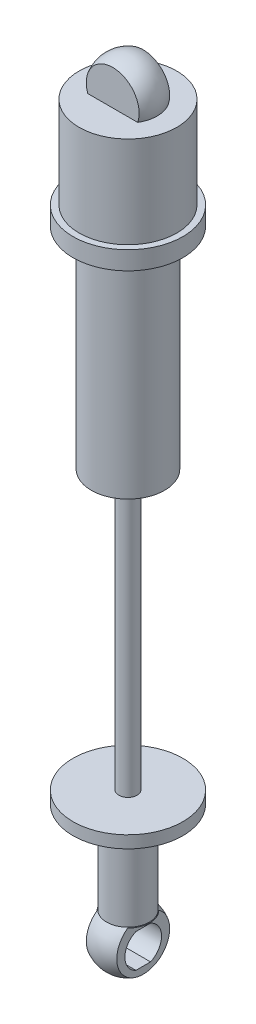
ISO-10303-21;
HEADER;
FILE_DESCRIPTION(('STEP AP214'),'2;1');
FILE_NAME('part.step','',(''),(''),'','','');
FILE_SCHEMA(('AUTOMOTIVE_DESIGN { 1 0 10303 214 1 1 1 1 }'));
ENDSEC;
DATA;
#1=APPLICATION_CONTEXT('core data for automotive mechanical design processes');
#2=APPLICATION_PROTOCOL_DEFINITION('international standard','automotive_design',2000,#1);
#3=PRODUCT_CONTEXT('',#1,'mechanical');
#4=PRODUCT('Part','Part','',(#3));
#5=PRODUCT_RELATED_PRODUCT_CATEGORY('part','',(#4));
#6=PRODUCT_DEFINITION_FORMATION('','',#4);
#7=PRODUCT_DEFINITION_CONTEXT('part definition',#1,'design');
#8=PRODUCT_DEFINITION('design','',#6,#7);
#9=PRODUCT_DEFINITION_SHAPE('','',#8);
#10=(LENGTH_UNIT() NAMED_UNIT(*) SI_UNIT(.MILLI.,.METRE.));
#11=(NAMED_UNIT(*) PLANE_ANGLE_UNIT() SI_UNIT($,.RADIAN.));
#12=(NAMED_UNIT(*) SI_UNIT($,.STERADIAN.) SOLID_ANGLE_UNIT());
#13=UNCERTAINTY_MEASURE_WITH_UNIT(LENGTH_MEASURE(1.E-05),#10,'distance_accuracy_value','');
#14=(GEOMETRIC_REPRESENTATION_CONTEXT(3) GLOBAL_UNCERTAINTY_ASSIGNED_CONTEXT((#13)) GLOBAL_UNIT_ASSIGNED_CONTEXT((#10,
#11,#12)) REPRESENTATION_CONTEXT('',''));
#15=CARTESIAN_POINT('',(0.,0.,0.));
#16=DIRECTION('',(0.,0.,1.));
#17=DIRECTION('',(1.,0.,0.));
#18=AXIS2_PLACEMENT_3D('',#15,#16,#17);
#19=CARTESIAN_POINT('',(0.,5.,0.));
#20=DIRECTION('',(0.,1.,0.));
#21=DIRECTION('',(-1.,0.,0.));
#22=AXIS2_PLACEMENT_3D('',#19,#20,#21);
#23=SPHERICAL_SURFACE('',#22,5.);
#24=CARTESIAN_POINT('',(0.,8.5,0.));
#25=DIRECTION('',(0.,1.,0.));
#26=DIRECTION('',(0.,0.,1.));
#27=AXIS2_PLACEMENT_3D('',#24,#25,#26);
#28=CIRCLE('',#27,3.57071421427143);
#29=CARTESIAN_POINT('',(-2.5,8.5,2.54950975679642));
#30=VERTEX_POINT('',#29);
#31=CARTESIAN_POINT('',(-2.5,8.5,-2.54950975679642));
#32=VERTEX_POINT('',#31);
#33=EDGE_CURVE('E228',#30,#32,#28,.F.);
#34=ORIENTED_EDGE('',*,*,#33,.F.);
#35=CARTESIAN_POINT('',(-2.5,5.,0.));
#36=DIRECTION('',(1.,0.,0.));
#37=DIRECTION('',(0.,0.,-1.));
#38=AXIS2_PLACEMENT_3D('',#35,#36,#37);
#39=CIRCLE('',#38,4.33012701892221);
#40=EDGE_CURVE('E227',#32,#30,#39,.F.);
#41=ORIENTED_EDGE('',*,*,#40,.F.);
#42=EDGE_LOOP('',(#34,#41));
#43=FACE_BOUND('',#42,.T.);
#44=CARTESIAN_POINT('',(2.5,8.5,-2.54950975679637));
#45=VERTEX_POINT('',#44);
#46=CARTESIAN_POINT('',(2.5,8.5,2.54950975679637));
#47=VERTEX_POINT('',#46);
#48=EDGE_CURVE('E223',#45,#47,#28,.F.);
#49=ORIENTED_EDGE('',*,*,#48,.F.);
#50=CARTESIAN_POINT('',(2.5,5.,0.));
#51=DIRECTION('',(-1.,0.,0.));
#52=DIRECTION('',(0.,0.,1.));
#53=AXIS2_PLACEMENT_3D('',#50,#51,#52);
#54=CIRCLE('',#53,4.33012701892218);
#55=EDGE_CURVE('E220',#47,#45,#54,.F.);
#56=ORIENTED_EDGE('',*,*,#55,.F.);
#57=EDGE_LOOP('',(#49,#56));
#58=FACE_BOUND('',#57,.T.);
#59=CARTESIAN_POINT('',(0.,8.57071421427147,0.));
#60=DIRECTION('',(0.,1.,0.));
#61=DIRECTION('',(0.,0.,1.));
#62=AXIS2_PLACEMENT_3D('',#59,#60,#61);
#63=CIRCLE('',#62,3.49999999999999);
#64=CARTESIAN_POINT('',(0.,8.57071421427147,3.49999999999999));
#65=VERTEX_POINT('',#64);
#66=EDGE_CURVE('E167',#65,#65,#63,.T.);
#67=ORIENTED_EDGE('',*,*,#66,.F.);
#68=EDGE_LOOP('',(#67));
#69=FACE_BOUND('',#68,.T.);
#70=ADVANCED_FACE('F41',(#43,#58,#69),#23,.T.);
#71=CARTESIAN_POINT('',(0.,125.,0.));
#72=DIRECTION('',(0.,1.,0.));
#73=DIRECTION('',(1.,0.,0.));
#74=AXIS2_PLACEMENT_3D('',#71,#72,#73);
#75=SPHERICAL_SURFACE('',#74,5.);
#76=CARTESIAN_POINT('',(-5.,125.,0.));
#77=VERTEX_POINT('',#76);
#78=VERTEX_LOOP('',#77);
#79=FACE_BOUND('',#78,.T.);
#80=CARTESIAN_POINT('',(5.,125.,0.));
#81=VERTEX_POINT('',#80);
#82=VERTEX_LOOP('',#81);
#83=FACE_BOUND('',#82,.T.);
#84=CARTESIAN_POINT('',(0.,125.,-2.5));
#85=DIRECTION('',(0.,0.,1.));
#86=DIRECTION('',(1.,0.,0.));
#87=AXIS2_PLACEMENT_3D('',#84,#85,#86);
#88=CIRCLE('',#87,4.3301270189222);
#89=CARTESIAN_POINT('',(-4.08743711177486,123.570714214271,-2.5));
#90=VERTEX_POINT('',#89);
#91=CARTESIAN_POINT('',(4.08743711177486,123.570714214271,-2.5));
#92=VERTEX_POINT('',#91);
#93=EDGE_CURVE('E164',#90,#92,#88,.F.);
#94=ORIENTED_EDGE('',*,*,#93,.F.);
#95=CARTESIAN_POINT('',(0.,123.570714214271,0.));
#96=DIRECTION('',(0.,1.,0.));
#97=DIRECTION('',(0.,0.,1.));
#98=AXIS2_PLACEMENT_3D('',#95,#96,#97);
#99=CIRCLE('',#98,4.79136119935811);
#100=CARTESIAN_POINT('',(-4.08743711177486,123.570714214271,2.5));
#101=VERTEX_POINT('',#100);
#102=EDGE_CURVE('E215',#90,#101,#99,.T.);
#103=ORIENTED_EDGE('',*,*,#102,.T.);
#104=CARTESIAN_POINT('',(0.,125.,2.5));
#105=DIRECTION('',(0.,0.,-1.));
#106=DIRECTION('',(-1.,0.,0.));
#107=AXIS2_PLACEMENT_3D('',#104,#105,#106);
#108=CIRCLE('',#107,4.3301270189222);
#109=CARTESIAN_POINT('',(4.08743711177486,123.570714214271,2.5));
#110=VERTEX_POINT('',#109);
#111=EDGE_CURVE('E161',#110,#101,#108,.F.);
#112=ORIENTED_EDGE('',*,*,#111,.F.);
#113=EDGE_CURVE('E216',#110,#92,#99,.T.);
#114=ORIENTED_EDGE('',*,*,#113,.T.);
#115=EDGE_LOOP('',(#94,#103,#112,#114));
#116=FACE_BOUND('',#115,.T.);
#117=ADVANCED_FACE('F256',(#79,#83,#116),#75,.T.);
#118=CARTESIAN_POINT('',(-8.,123.570714214271,0.));
#119=DIRECTION('',(0.,1.,0.));
#120=DIRECTION('',(0.,0.,1.));
#121=AXIS2_PLACEMENT_3D('',#118,#119,#120);
#122=PLANE('',#121);
#123=ORIENTED_EDGE('',*,*,#102,.F.);
#124=DIRECTION('',(-1.,0.,0.));
#125=VECTOR('',#124,1.);
#126=CARTESIAN_POINT('',(-5.00000000000001,123.570714214271,-2.5));
#127=LINE('',#126,#125);
#128=EDGE_CURVE('E155',#92,#90,#127,.T.);
#129=ORIENTED_EDGE('',*,*,#128,.F.);
#130=ORIENTED_EDGE('',*,*,#113,.F.);
#131=DIRECTION('',(1.,0.,0.));
#132=VECTOR('',#131,1.);
#133=CARTESIAN_POINT('',(-5.00000000000001,123.570714214271,2.5));
#134=LINE('',#133,#132);
#135=EDGE_CURVE('E158',#101,#110,#134,.T.);
#136=ORIENTED_EDGE('',*,*,#135,.F.);
#137=EDGE_LOOP('',(#123,#129,#130,#136));
#138=FACE_BOUND('',#137,.T.);
#139=CARTESIAN_POINT('',(0.,123.570714214271,0.));
#140=DIRECTION('',(0.,1.,0.));
#141=DIRECTION('',(0.,0.,1.));
#142=AXIS2_PLACEMENT_3D('',#139,#140,#141);
#143=CIRCLE('',#142,8.);
#144=CARTESIAN_POINT('',(0.,123.570714214271,8.));
#145=VERTEX_POINT('',#144);
#146=EDGE_CURVE('E211',#145,#145,#143,.T.);
#147=ORIENTED_EDGE('',*,*,#146,.T.);
#148=EDGE_LOOP('',(#147));
#149=FACE_BOUND('',#148,.T.);
#150=ADVANCED_FACE('F261',(#138,#149),#122,.T.);
#151=CARTESIAN_POINT('',(0.,125.,0.));
#152=DIRECTION('',(0.,1.,0.));
#153=DIRECTION('',(0.,0.,1.));
#154=AXIS2_PLACEMENT_3D('',#151,#152,#153);
#155=CYLINDRICAL_SURFACE('',#154,8.);
#156=CARTESIAN_POINT('',(0.,108.570714214271,0.));
#157=DIRECTION('',(0.,1.,0.));
#158=DIRECTION('',(0.,0.,1.));
#159=AXIS2_PLACEMENT_3D('',#156,#157,#158);
#160=CIRCLE('',#159,8.);
#161=CARTESIAN_POINT('',(0.,108.570714214271,8.));
#162=VERTEX_POINT('',#161);
#163=EDGE_CURVE('E207',#162,#162,#160,.T.);
#164=ORIENTED_EDGE('',*,*,#163,.T.);
#165=EDGE_LOOP('',(#164));
#166=FACE_BOUND('',#165,.T.);
#167=ORIENTED_EDGE('',*,*,#146,.F.);
#168=EDGE_LOOP('',(#167));
#169=FACE_BOUND('',#168,.T.);
#170=ADVANCED_FACE('F330',(#166,#169),#155,.T.);
#171=CARTESIAN_POINT('',(-9.,108.570714214271,0.));
#172=DIRECTION('',(0.,1.,0.));
#173=DIRECTION('',(0.,0.,1.));
#174=AXIS2_PLACEMENT_3D('',#171,#172,#173);
#175=PLANE('',#174);
#176=CARTESIAN_POINT('',(0.,108.570714214271,0.));
#177=DIRECTION('',(0.,1.,0.));
#178=DIRECTION('',(0.,0.,1.));
#179=AXIS2_PLACEMENT_3D('',#176,#177,#178);
#180=CIRCLE('',#179,9.);
#181=CARTESIAN_POINT('',(0.,108.570714214271,9.));
#182=VERTEX_POINT('',#181);
#183=EDGE_CURVE('E203',#182,#182,#180,.T.);
#184=ORIENTED_EDGE('',*,*,#183,.T.);
#185=EDGE_LOOP('',(#184));
#186=FACE_BOUND('',#185,.T.);
#187=ORIENTED_EDGE('',*,*,#163,.F.);
#188=EDGE_LOOP('',(#187));
#189=FACE_BOUND('',#188,.T.);
#190=ADVANCED_FACE('F324',(#186,#189),#175,.T.);
#191=CARTESIAN_POINT('',(0.,125.,0.));
#192=DIRECTION('',(0.,1.,0.));
#193=DIRECTION('',(0.,0.,1.));
#194=AXIS2_PLACEMENT_3D('',#191,#192,#193);
#195=CYLINDRICAL_SURFACE('',#194,9.);
#196=CARTESIAN_POINT('',(0.,105.570714214271,0.));
#197=DIRECTION('',(0.,1.,0.));
#198=DIRECTION('',(0.,0.,1.));
#199=AXIS2_PLACEMENT_3D('',#196,#197,#198);
#200=CIRCLE('',#199,9.);
#201=CARTESIAN_POINT('',(0.,105.570714214271,9.));
#202=VERTEX_POINT('',#201);
#203=EDGE_CURVE('E199',#202,#202,#200,.T.);
#204=ORIENTED_EDGE('',*,*,#203,.T.);
#205=EDGE_LOOP('',(#204));
#206=FACE_BOUND('',#205,.T.);
#207=ORIENTED_EDGE('',*,*,#183,.F.);
#208=EDGE_LOOP('',(#207));
#209=FACE_BOUND('',#208,.T.);
#210=ADVANCED_FACE('F318',(#206,#209),#195,.T.);
#211=CARTESIAN_POINT('',(-5.99999999999999,105.570714214271,0.));
#212=DIRECTION('',(0.,-1.,0.));
#213=DIRECTION('',(0.,0.,-1.));
#214=AXIS2_PLACEMENT_3D('',#211,#212,#213);
#215=PLANE('',#214);
#216=CARTESIAN_POINT('',(0.,105.570714214271,0.));
#217=DIRECTION('',(0.,1.,0.));
#218=DIRECTION('',(0.,0.,1.));
#219=AXIS2_PLACEMENT_3D('',#216,#217,#218);
#220=CIRCLE('',#219,5.99999999999999);
#221=CARTESIAN_POINT('',(0.,105.570714214271,5.99999999999999));
#222=VERTEX_POINT('',#221);
#223=EDGE_CURVE('E195',#222,#222,#220,.T.);
#224=ORIENTED_EDGE('',*,*,#223,.T.);
#225=EDGE_LOOP('',(#224));
#226=FACE_BOUND('',#225,.T.);
#227=ORIENTED_EDGE('',*,*,#203,.F.);
#228=EDGE_LOOP('',(#227));
#229=FACE_BOUND('',#228,.T.);
#230=ADVANCED_FACE('F312',(#226,#229),#215,.T.);
#231=CARTESIAN_POINT('',(0.,125.,0.));
#232=DIRECTION('',(0.,1.,0.));
#233=DIRECTION('',(0.,0.,1.));
#234=AXIS2_PLACEMENT_3D('',#231,#232,#233);
#235=CYLINDRICAL_SURFACE('',#234,5.99999999999999);
#236=CARTESIAN_POINT('',(0.,71.0707142142715,0.));
#237=DIRECTION('',(0.,1.,0.));
#238=DIRECTION('',(0.,0.,1.));
#239=AXIS2_PLACEMENT_3D('',#236,#237,#238);
#240=CIRCLE('',#239,5.99999999999999);
#241=CARTESIAN_POINT('',(0.,71.0707142142715,5.99999999999999));
#242=VERTEX_POINT('',#241);
#243=EDGE_CURVE('E191',#242,#242,#240,.T.);
#244=ORIENTED_EDGE('',*,*,#243,.T.);
#245=EDGE_LOOP('',(#244));
#246=FACE_BOUND('',#245,.T.);
#247=ORIENTED_EDGE('',*,*,#223,.F.);
#248=EDGE_LOOP('',(#247));
#249=FACE_BOUND('',#248,.T.);
#250=ADVANCED_FACE('F306',(#246,#249),#235,.T.);
#251=CARTESIAN_POINT('',(-1.49999999999999,71.0707142142715,0.));
#252=DIRECTION('',(0.,-1.,0.));
#253=DIRECTION('',(0.,0.,-1.));
#254=AXIS2_PLACEMENT_3D('',#251,#252,#253);
#255=PLANE('',#254);
#256=CARTESIAN_POINT('',(0.,71.0707142142715,0.));
#257=DIRECTION('',(0.,1.,0.));
#258=DIRECTION('',(0.,0.,1.));
#259=AXIS2_PLACEMENT_3D('',#256,#257,#258);
#260=CIRCLE('',#259,1.49999999999999);
#261=CARTESIAN_POINT('',(0.,71.0707142142715,1.49999999999999));
#262=VERTEX_POINT('',#261);
#263=EDGE_CURVE('E187',#262,#262,#260,.T.);
#264=ORIENTED_EDGE('',*,*,#263,.T.);
#265=EDGE_LOOP('',(#264));
#266=FACE_BOUND('',#265,.T.);
#267=ORIENTED_EDGE('',*,*,#243,.F.);
#268=EDGE_LOOP('',(#267));
#269=FACE_BOUND('',#268,.T.);
#270=ADVANCED_FACE('F300',(#266,#269),#255,.T.);
#271=CARTESIAN_POINT('',(0.,125.,0.));
#272=DIRECTION('',(0.,1.,0.));
#273=DIRECTION('',(0.,0.,1.));
#274=AXIS2_PLACEMENT_3D('',#271,#272,#273);
#275=CYLINDRICAL_SURFACE('',#274,1.49999999999999);
#276=CARTESIAN_POINT('',(0.,25.5707142142715,0.));
#277=DIRECTION('',(0.,1.,0.));
#278=DIRECTION('',(0.,0.,1.));
#279=AXIS2_PLACEMENT_3D('',#276,#277,#278);
#280=CIRCLE('',#279,1.49999999999999);
#281=CARTESIAN_POINT('',(0.,25.5707142142715,1.49999999999999));
#282=VERTEX_POINT('',#281);
#283=EDGE_CURVE('E183',#282,#282,#280,.T.);
#284=ORIENTED_EDGE('',*,*,#283,.T.);
#285=EDGE_LOOP('',(#284));
#286=FACE_BOUND('',#285,.T.);
#287=ORIENTED_EDGE('',*,*,#263,.F.);
#288=EDGE_LOOP('',(#287));
#289=FACE_BOUND('',#288,.T.);
#290=ADVANCED_FACE('F294',(#286,#289),#275,.T.);
#291=CARTESIAN_POINT('',(-8.99999999999999,25.5707142142715,0.));
#292=DIRECTION('',(0.,1.,0.));
#293=DIRECTION('',(0.,0.,1.));
#294=AXIS2_PLACEMENT_3D('',#291,#292,#293);
#295=PLANE('',#294);
#296=CARTESIAN_POINT('',(0.,25.5707142142715,0.));
#297=DIRECTION('',(0.,1.,0.));
#298=DIRECTION('',(0.,0.,1.));
#299=AXIS2_PLACEMENT_3D('',#296,#297,#298);
#300=CIRCLE('',#299,8.99999999999999);
#301=CARTESIAN_POINT('',(0.,25.5707142142715,8.99999999999999));
#302=VERTEX_POINT('',#301);
#303=EDGE_CURVE('E179',#302,#302,#300,.T.);
#304=ORIENTED_EDGE('',*,*,#303,.T.);
#305=EDGE_LOOP('',(#304));
#306=FACE_BOUND('',#305,.T.);
#307=ORIENTED_EDGE('',*,*,#283,.F.);
#308=EDGE_LOOP('',(#307));
#309=FACE_BOUND('',#308,.T.);
#310=ADVANCED_FACE('F288',(#306,#309),#295,.T.);
#311=CARTESIAN_POINT('',(0.,125.,0.));
#312=DIRECTION('',(0.,1.,0.));
#313=DIRECTION('',(0.,0.,1.));
#314=AXIS2_PLACEMENT_3D('',#311,#312,#313);
#315=CYLINDRICAL_SURFACE('',#314,8.99999999999999);
#316=CARTESIAN_POINT('',(0.,23.5707142142715,0.));
#317=DIRECTION('',(0.,1.,0.));
#318=DIRECTION('',(0.,0.,1.));
#319=AXIS2_PLACEMENT_3D('',#316,#317,#318);
#320=CIRCLE('',#319,8.99999999999999);
#321=CARTESIAN_POINT('',(0.,23.5707142142715,8.99999999999999));
#322=VERTEX_POINT('',#321);
#323=EDGE_CURVE('E175',#322,#322,#320,.T.);
#324=ORIENTED_EDGE('',*,*,#323,.T.);
#325=EDGE_LOOP('',(#324));
#326=FACE_BOUND('',#325,.T.);
#327=ORIENTED_EDGE('',*,*,#303,.F.);
#328=EDGE_LOOP('',(#327));
#329=FACE_BOUND('',#328,.T.);
#330=ADVANCED_FACE('F282',(#326,#329),#315,.T.);
#331=CARTESIAN_POINT('',(-3.49999999999999,23.5707142142715,0.));
#332=DIRECTION('',(0.,-1.,0.));
#333=DIRECTION('',(0.,0.,-1.));
#334=AXIS2_PLACEMENT_3D('',#331,#332,#333);
#335=PLANE('',#334);
#336=CARTESIAN_POINT('',(0.,23.5707142142715,0.));
#337=DIRECTION('',(0.,1.,0.));
#338=DIRECTION('',(0.,0.,1.));
#339=AXIS2_PLACEMENT_3D('',#336,#337,#338);
#340=CIRCLE('',#339,3.49999999999999);
#341=CARTESIAN_POINT('',(0.,23.5707142142715,3.49999999999999));
#342=VERTEX_POINT('',#341);
#343=EDGE_CURVE('E171',#342,#342,#340,.T.);
#344=ORIENTED_EDGE('',*,*,#343,.T.);
#345=EDGE_LOOP('',(#344));
#346=FACE_BOUND('',#345,.T.);
#347=ORIENTED_EDGE('',*,*,#323,.F.);
#348=EDGE_LOOP('',(#347));
#349=FACE_BOUND('',#348,.T.);
#350=ADVANCED_FACE('F276',(#346,#349),#335,.T.);
#351=CARTESIAN_POINT('',(0.,125.,0.));
#352=DIRECTION('',(0.,1.,0.));
#353=DIRECTION('',(0.,0.,1.));
#354=AXIS2_PLACEMENT_3D('',#351,#352,#353);
#355=CYLINDRICAL_SURFACE('',#354,3.49999999999999);
#356=ORIENTED_EDGE('',*,*,#66,.T.);
#357=EDGE_LOOP('',(#356));
#358=FACE_BOUND('',#357,.T.);
#359=ORIENTED_EDGE('',*,*,#343,.F.);
#360=EDGE_LOOP('',(#359));
#361=FACE_BOUND('',#360,.T.);
#362=ADVANCED_FACE('F272',(#358,#361),#355,.T.);
#363=CARTESIAN_POINT('',(-5.00000000000001,133.570714214271,2.5));
#364=DIRECTION('',(0.,0.,-1.));
#365=DIRECTION('',(-1.,0.,0.));
#366=AXIS2_PLACEMENT_3D('',#363,#364,#365);
#367=PLANE('',#366);
#368=ORIENTED_EDGE('',*,*,#111,.T.);
#369=ORIENTED_EDGE('',*,*,#135,.T.);
#370=EDGE_LOOP('',(#368,#369));
#371=FACE_BOUND('',#370,.T.);
#372=ADVANCED_FACE('F275',(#371),#367,.F.);
#373=CARTESIAN_POINT('',(-5.00000000000001,133.570714214271,-2.5));
#374=DIRECTION('',(0.,0.,1.));
#375=DIRECTION('',(1.,0.,0.));
#376=AXIS2_PLACEMENT_3D('',#373,#374,#375);
#377=PLANE('',#376);
#378=ORIENTED_EDGE('',*,*,#93,.T.);
#379=ORIENTED_EDGE('',*,*,#128,.T.);
#380=EDGE_LOOP('',(#378,#379));
#381=FACE_BOUND('',#380,.T.);
#382=ADVANCED_FACE('F346',(#381),#377,.F.);
#383=CARTESIAN_POINT('',(2.5,8.5,-10.));
#384=DIRECTION('',(-1.,0.,0.));
#385=DIRECTION('',(0.,0.,1.));
#386=AXIS2_PLACEMENT_3D('',#383,#384,#385);
#387=PLANE('',#386);
#388=DIRECTION('',(0.,0.,-1.));
#389=VECTOR('',#388,1.);
#390=CARTESIAN_POINT('',(2.5,1.83493649053891,1.19895788082818));
#391=LINE('',#390,#389);
#392=CARTESIAN_POINT('',(2.5,1.83493649053891,1.19895788082819));
#393=VERTEX_POINT('',#392);
#394=CARTESIAN_POINT('',(2.5,1.83493649053891,-1.19895788082818));
#395=VERTEX_POINT('',#394);
#396=EDGE_CURVE('E125',#393,#395,#391,.T.);
#397=ORIENTED_EDGE('',*,*,#396,.F.);
#398=CARTESIAN_POINT('',(2.5,4.58493649053891,0.));
#399=DIRECTION('',(1.,0.,0.));
#400=DIRECTION('',(0.,0.,-1.));
#401=AXIS2_PLACEMENT_3D('',#398,#399,#400);
#402=CIRCLE('',#401,3.);
#403=CARTESIAN_POINT('',(2.5,7.33493649053891,1.19895788082818));
#404=VERTEX_POINT('',#403);
#405=EDGE_CURVE('E56',#404,#393,#402,.T.);
#406=ORIENTED_EDGE('',*,*,#405,.F.);
#407=DIRECTION('',(0.,0.,1.));
#408=VECTOR('',#407,1.);
#409=CARTESIAN_POINT('',(2.5,7.33493649053891,1.19895788082818));
#410=LINE('',#409,#408);
#411=CARTESIAN_POINT('',(2.5,7.33493649053891,-1.19895788082818));
#412=VERTEX_POINT('',#411);
#413=EDGE_CURVE('E133',#412,#404,#410,.T.);
#414=ORIENTED_EDGE('',*,*,#413,.F.);
#415=CARTESIAN_POINT('',(2.5,4.58493649053891,0.));
#416=DIRECTION('',(1.,0.,0.));
#417=DIRECTION('',(0.,0.,-1.));
#418=AXIS2_PLACEMENT_3D('',#415,#416,#417);
#419=CIRCLE('',#418,3.);
#420=EDGE_CURVE('E115',#395,#412,#419,.T.);
#421=ORIENTED_EDGE('',*,*,#420,.F.);
#422=EDGE_LOOP('',(#397,#406,#414,#421));
#423=FACE_BOUND('',#422,.T.);
#424=ORIENTED_EDGE('',*,*,#55,.T.);
#425=DIRECTION('',(0.,0.,-1.));
#426=VECTOR('',#425,1.);
#427=CARTESIAN_POINT('',(2.5,8.5,-10.));
#428=LINE('',#427,#426);
#429=EDGE_CURVE('E151',#47,#45,#428,.T.);
#430=ORIENTED_EDGE('',*,*,#429,.F.);
#431=EDGE_LOOP('',(#424,#430));
#432=FACE_BOUND('',#431,.T.);
#433=ADVANCED_FACE('F130',(#423,#432),#387,.F.);
#434=CARTESIAN_POINT('',(0.,8.5,0.));
#435=DIRECTION('',(0.,1.,0.));
#436=DIRECTION('',(0.,0.,1.));
#437=AXIS2_PLACEMENT_3D('',#434,#435,#436);
#438=PLANE('',#437);
#439=ORIENTED_EDGE('',*,*,#48,.T.);
#440=ORIENTED_EDGE('',*,*,#429,.T.);
#441=EDGE_LOOP('',(#439,#440));
#442=FACE_BOUND('',#441,.T.);
#443=ADVANCED_FACE('F353',(#442),#438,.F.);
#444=ORIENTED_EDGE('',*,*,#33,.T.);
#445=DIRECTION('',(0.,0.,1.));
#446=VECTOR('',#445,1.);
#447=CARTESIAN_POINT('',(-2.5,8.5,-10.));
#448=LINE('',#447,#446);
#449=EDGE_CURVE('E143',#32,#30,#448,.T.);
#450=ORIENTED_EDGE('',*,*,#449,.T.);
#451=EDGE_LOOP('',(#444,#450));
#452=FACE_BOUND('',#451,.T.);
#453=ADVANCED_FACE('F251',(#452),#438,.F.);
#454=CARTESIAN_POINT('',(-2.5,8.5,-10.));
#455=DIRECTION('',(1.,0.,0.));
#456=DIRECTION('',(0.,0.,-1.));
#457=AXIS2_PLACEMENT_3D('',#454,#455,#456);
#458=PLANE('',#457);
#459=DIRECTION('',(0.,0.,1.));
#460=VECTOR('',#459,1.);
#461=CARTESIAN_POINT('',(-2.5,7.33493649053891,-10.));
#462=LINE('',#461,#460);
#463=CARTESIAN_POINT('',(-2.5,7.33493649053891,-1.19895788082818));
#464=VERTEX_POINT('',#463);
#465=CARTESIAN_POINT('',(-2.5,7.33493649053891,1.19895788082818));
#466=VERTEX_POINT('',#465);
#467=EDGE_CURVE('E49',#464,#466,#462,.T.);
#468=ORIENTED_EDGE('',*,*,#467,.T.);
#469=CARTESIAN_POINT('',(-2.5,4.58493649053891,0.));
#470=DIRECTION('',(1.,0.,0.));
#471=DIRECTION('',(0.,0.,-1.));
#472=AXIS2_PLACEMENT_3D('',#469,#470,#471);
#473=CIRCLE('',#472,3.);
#474=CARTESIAN_POINT('',(-2.5,1.83493649053891,1.19895788082818));
#475=VERTEX_POINT('',#474);
#476=EDGE_CURVE('E12',#466,#475,#473,.T.);
#477=ORIENTED_EDGE('',*,*,#476,.T.);
#478=DIRECTION('',(0.,0.,-1.));
#479=VECTOR('',#478,1.);
#480=CARTESIAN_POINT('',(-2.5,1.83493649053891,-10.));
#481=LINE('',#480,#479);
#482=CARTESIAN_POINT('',(-2.5,1.83493649053891,-1.19895788082818));
#483=VERTEX_POINT('',#482);
#484=EDGE_CURVE('E231',#475,#483,#481,.T.);
#485=ORIENTED_EDGE('',*,*,#484,.T.);
#486=CARTESIAN_POINT('',(-2.5,4.58493649053891,0.));
#487=DIRECTION('',(1.,0.,0.));
#488=DIRECTION('',(0.,0.,-1.));
#489=AXIS2_PLACEMENT_3D('',#486,#487,#488);
#490=CIRCLE('',#489,3.);
#491=EDGE_CURVE('E118',#483,#464,#490,.T.);
#492=ORIENTED_EDGE('',*,*,#491,.T.);
#493=EDGE_LOOP('',(#468,#477,#485,#492));
#494=FACE_BOUND('',#493,.T.);
#495=ORIENTED_EDGE('',*,*,#40,.T.);
#496=ORIENTED_EDGE('',*,*,#449,.F.);
#497=EDGE_LOOP('',(#495,#496));
#498=FACE_BOUND('',#497,.T.);
#499=ADVANCED_FACE('F238',(#494,#498),#458,.F.);
#500=CARTESIAN_POINT('',(-9.,4.58493649053891,0.));
#501=DIRECTION('',(1.,0.,0.));
#502=DIRECTION('',(0.,0.,-1.));
#503=AXIS2_PLACEMENT_3D('',#500,#501,#502);
#504=CYLINDRICAL_SURFACE('',#503,3.);
#505=DIRECTION('',(1.,0.,0.));
#506=VECTOR('',#505,1.);
#507=CARTESIAN_POINT('',(-9.,7.33493649053891,1.19895788082818));
#508=LINE('',#507,#506);
#509=EDGE_CURVE('E140',#466,#404,#508,.T.);
#510=ORIENTED_EDGE('',*,*,#509,.T.);
#511=ORIENTED_EDGE('',*,*,#405,.T.);
#512=DIRECTION('',(1.,0.,0.));
#513=VECTOR('',#512,1.);
#514=CARTESIAN_POINT('',(-9.,1.83493649053891,1.19895788082818));
#515=LINE('',#514,#513);
#516=EDGE_CURVE('E122',#475,#393,#515,.T.);
#517=ORIENTED_EDGE('',*,*,#516,.F.);
#518=ORIENTED_EDGE('',*,*,#476,.F.);
#519=EDGE_LOOP('',(#510,#511,#517,#518));
#520=FACE_BOUND('',#519,.T.);
#521=ADVANCED_FACE('F243',(#520),#504,.F.);
#522=CARTESIAN_POINT('',(-9.,7.33493649053891,1.19895788082818));
#523=DIRECTION('',(0.,1.,0.));
#524=DIRECTION('',(0.,0.,1.));
#525=AXIS2_PLACEMENT_3D('',#522,#523,#524);
#526=PLANE('',#525);
#527=DIRECTION('',(1.,0.,0.));
#528=VECTOR('',#527,1.);
#529=CARTESIAN_POINT('',(-9.,7.33493649053891,-1.19895788082818));
#530=LINE('',#529,#528);
#531=EDGE_CURVE('E121',#464,#412,#530,.T.);
#532=ORIENTED_EDGE('',*,*,#531,.T.);
#533=ORIENTED_EDGE('',*,*,#413,.T.);
#534=ORIENTED_EDGE('',*,*,#509,.F.);
#535=ORIENTED_EDGE('',*,*,#467,.F.);
#536=EDGE_LOOP('',(#532,#533,#534,#535));
#537=FACE_BOUND('',#536,.T.);
#538=ADVANCED_FACE('F242',(#537),#526,.F.);
#539=CARTESIAN_POINT('',(-9.,4.58493649053891,0.));
#540=DIRECTION('',(1.,0.,0.));
#541=DIRECTION('',(0.,0.,-1.));
#542=AXIS2_PLACEMENT_3D('',#539,#540,#541);
#543=CYLINDRICAL_SURFACE('',#542,3.);
#544=DIRECTION('',(1.,0.,0.));
#545=VECTOR('',#544,1.);
#546=CARTESIAN_POINT('',(-9.,1.83493649053891,-1.19895788082818));
#547=LINE('',#546,#545);
#548=EDGE_CURVE('E64',#483,#395,#547,.T.);
#549=ORIENTED_EDGE('',*,*,#548,.T.);
#550=ORIENTED_EDGE('',*,*,#420,.T.);
#551=ORIENTED_EDGE('',*,*,#531,.F.);
#552=ORIENTED_EDGE('',*,*,#491,.F.);
#553=EDGE_LOOP('',(#549,#550,#551,#552));
#554=FACE_BOUND('',#553,.T.);
#555=ADVANCED_FACE('F112',(#554),#543,.F.);
#556=CARTESIAN_POINT('',(-9.,1.83493649053891,1.19895788082818));
#557=DIRECTION('',(0.,-1.,0.));
#558=DIRECTION('',(0.,0.,-1.));
#559=AXIS2_PLACEMENT_3D('',#556,#557,#558);
#560=PLANE('',#559);
#561=ORIENTED_EDGE('',*,*,#516,.T.);
#562=ORIENTED_EDGE('',*,*,#396,.T.);
#563=ORIENTED_EDGE('',*,*,#548,.F.);
#564=ORIENTED_EDGE('',*,*,#484,.F.);
#565=EDGE_LOOP('',(#561,#562,#563,#564));
#566=FACE_BOUND('',#565,.T.);
#567=ADVANCED_FACE('F126',(#566),#560,.F.);
#568=CLOSED_SHELL('',(#70,#117,#150,#170,#190,#210,#230,#250,#270,#290,#310,#330,#350,#362,#372,
#382,#433,#443,#453,#499,#521,#538,#555,#567));
#569=MANIFOLD_SOLID_BREP('B2',#568);
#570=ADVANCED_BREP_SHAPE_REPRESENTATION('',(#18,#569),#14);
#571=SHAPE_DEFINITION_REPRESENTATION(#9,#570);
ENDSEC;
END-ISO-10303-21;
